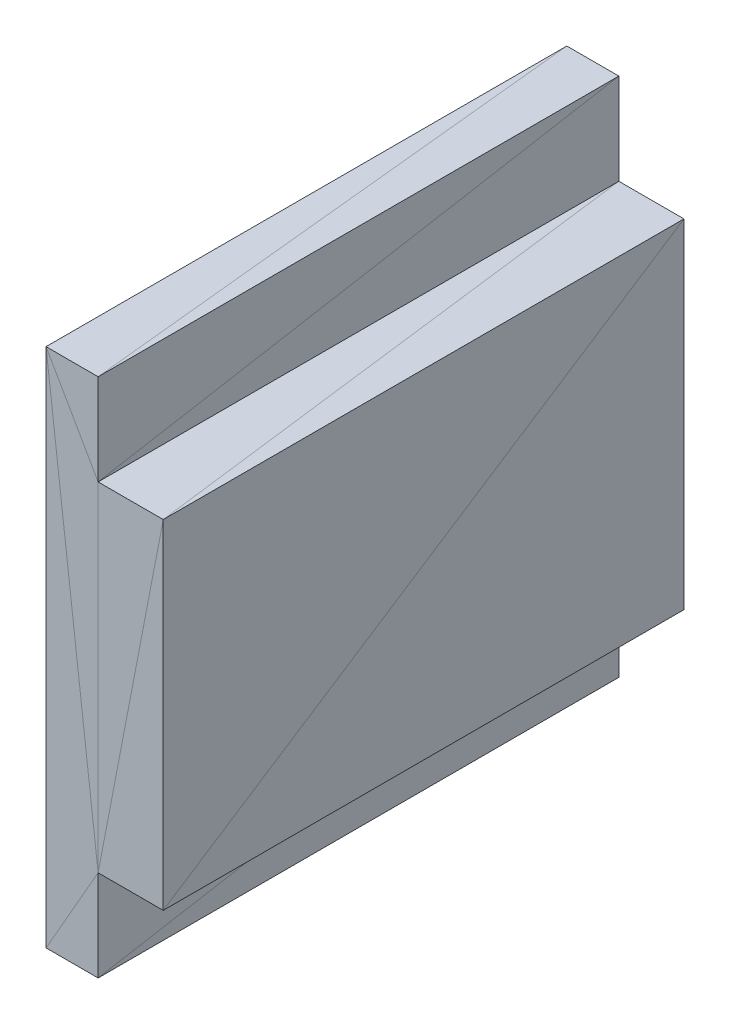
ISO-10303-21;
HEADER;
FILE_DESCRIPTION(('STEP AP214'),'2;1');
FILE_NAME('part.step','',(''),(''),'','','');
FILE_SCHEMA(('AUTOMOTIVE_DESIGN { 1 0 10303 214 1 1 1 1 }'));
ENDSEC;
DATA;
#1=APPLICATION_CONTEXT('core data for automotive mechanical design processes');
#2=APPLICATION_PROTOCOL_DEFINITION('international standard','automotive_design',2000,#1);
#3=PRODUCT_CONTEXT('',#1,'mechanical');
#4=PRODUCT('Part','Part','',(#3));
#5=PRODUCT_RELATED_PRODUCT_CATEGORY('part','',(#4));
#6=PRODUCT_DEFINITION_FORMATION('','',#4);
#7=PRODUCT_DEFINITION_CONTEXT('part definition',#1,'design');
#8=PRODUCT_DEFINITION('design','',#6,#7);
#9=PRODUCT_DEFINITION_SHAPE('','',#8);
#10=(LENGTH_UNIT() NAMED_UNIT(*) SI_UNIT(.MILLI.,.METRE.));
#11=(NAMED_UNIT(*) PLANE_ANGLE_UNIT() SI_UNIT($,.RADIAN.));
#12=(NAMED_UNIT(*) SI_UNIT($,.STERADIAN.) SOLID_ANGLE_UNIT());
#13=UNCERTAINTY_MEASURE_WITH_UNIT(LENGTH_MEASURE(1.E-05),#10,'distance_accuracy_value','');
#14=(GEOMETRIC_REPRESENTATION_CONTEXT(3) GLOBAL_UNCERTAINTY_ASSIGNED_CONTEXT((#13)) GLOBAL_UNIT_ASSIGNED_CONTEXT((#10,
#11,#12)) REPRESENTATION_CONTEXT('',''));
#15=CARTESIAN_POINT('',(0.,0.,0.));
#16=DIRECTION('',(0.,0.,1.));
#17=DIRECTION('',(1.,0.,0.));
#18=AXIS2_PLACEMENT_3D('',#15,#16,#17);
#19=CARTESIAN_POINT('',(0.,0.,0.));
#20=DIRECTION('',(0.,0.,1.));
#21=DIRECTION('',(1.,0.,0.));
#22=AXIS2_PLACEMENT_3D('',#19,#20,#21);
#23=PLANE('',#22);
#24=DIRECTION('',(0.,1.,0.));
#25=VECTOR('',#24,1.);
#26=CARTESIAN_POINT('',(5.71499997749925,4.44499962031841,0.));
#27=LINE('',#26,#25);
#28=CARTESIAN_POINT('',(5.71499997749925,4.44499962031841,0.));
#29=VERTEX_POINT('',#28);
#30=CARTESIAN_POINT('',(5.71499997749925,20.9550000727177,0.));
#31=VERTEX_POINT('',#30);
#32=EDGE_CURVE('E19',#29,#31,#27,.T.);
#33=ORIENTED_EDGE('',*,*,#32,.F.);
#34=DIRECTION('',(0.1888473864591,-0.982006448363537,0.));
#35=VECTOR('',#34,1.);
#36=CARTESIAN_POINT('',(2.54000001586974,20.9550000727177,0.));
#37=LINE('',#36,#35);
#38=CARTESIAN_POINT('',(2.54000001586974,20.9550000727177,0.));
#39=VERTEX_POINT('',#38);
#40=EDGE_CURVE('E98',#39,#29,#37,.T.);
#41=ORIENTED_EDGE('',*,*,#40,.F.);
#42=DIRECTION('',(-1.,0.,0.));
#43=VECTOR('',#42,1.);
#44=CARTESIAN_POINT('',(5.71499997749925,20.9550000727177,0.));
#45=LINE('',#44,#43);
#46=EDGE_CURVE('E101',#31,#39,#45,.T.);
#47=ORIENTED_EDGE('',*,*,#46,.F.);
#48=EDGE_LOOP('',(#33,#41,#47));
#49=FACE_BOUND('',#48,.T.);
#50=ADVANCED_FACE('F16',(#49),#23,.F.);
#51=CARTESIAN_POINT('',(5.71499997749925,0.,0.));
#52=DIRECTION('',(-1.,0.,0.));
#53=DIRECTION('',(0.,0.,1.));
#54=AXIS2_PLACEMENT_3D('',#51,#52,#53);
#55=PLANE('',#54);
#56=ORIENTED_EDGE('',*,*,#32,.T.);
#57=DIRECTION('',(0.,0.544988365723572,-0.838443606467335));
#58=VECTOR('',#57,1.);
#59=CARTESIAN_POINT('',(5.71499997749925,4.44499962031841,25.3999996930361));
#60=LINE('',#59,#58);
#61=CARTESIAN_POINT('',(5.71499997749925,4.44499962031841,25.3999996930361));
#62=VERTEX_POINT('',#61);
#63=EDGE_CURVE('E88',#62,#31,#60,.T.);
#64=ORIENTED_EDGE('',*,*,#63,.F.);
#65=DIRECTION('',(0.,0.,1.));
#66=VECTOR('',#65,1.);
#67=CARTESIAN_POINT('',(5.71499997749925,4.44499962031841,0.));
#68=LINE('',#67,#66);
#69=EDGE_CURVE('E84',#29,#62,#68,.T.);
#70=ORIENTED_EDGE('',*,*,#69,.F.);
#71=EDGE_LOOP('',(#56,#64,#70));
#72=FACE_BOUND('',#71,.T.);
#73=ADVANCED_FACE('F86',(#72),#55,.F.);
#74=CARTESIAN_POINT('',(5.71499997749925,0.,0.));
#75=DIRECTION('',(1.,0.,0.));
#76=DIRECTION('',(0.,0.,-1.));
#77=AXIS2_PLACEMENT_3D('',#74,#75,#76);
#78=PLANE('',#77);
#79=DIRECTION('',(0.,0.,-1.));
#80=VECTOR('',#79,1.);
#81=CARTESIAN_POINT('',(5.71499997749925,20.9550000727177,25.3999996930361));
#82=LINE('',#81,#80);
#83=CARTESIAN_POINT('',(5.71499997749925,20.9550000727177,25.3999996930361));
#84=VERTEX_POINT('',#83);
#85=EDGE_CURVE('E122',#84,#31,#82,.T.);
#86=ORIENTED_EDGE('',*,*,#85,.F.);
#87=DIRECTION('',(0.,1.,0.));
#88=VECTOR('',#87,1.);
#89=CARTESIAN_POINT('',(5.71499997749925,4.44499962031841,25.3999996930361));
#90=LINE('',#89,#88);
#91=EDGE_CURVE('E78',#62,#84,#90,.T.);
#92=ORIENTED_EDGE('',*,*,#91,.F.);
#93=ORIENTED_EDGE('',*,*,#63,.T.);
#94=EDGE_LOOP('',(#86,#92,#93));
#95=FACE_BOUND('',#94,.T.);
#96=ADVANCED_FACE('F126',(#95),#78,.T.);
#97=CARTESIAN_POINT('',(0.,0.,0.));
#98=DIRECTION('',(0.,0.,-1.));
#99=DIRECTION('',(-1.,0.,0.));
#100=AXIS2_PLACEMENT_3D('',#97,#98,#99);
#101=PLANE('',#100);
#102=DIRECTION('',(1.,0.,0.));
#103=VECTOR('',#102,1.);
#104=CARTESIAN_POINT('',(2.54000001586974,4.44499962031841,0.));
#105=LINE('',#104,#103);
#106=CARTESIAN_POINT('',(2.54000001586974,4.44499962031841,0.));
#107=VERTEX_POINT('',#106);
#108=EDGE_CURVE('E94',#107,#29,#105,.T.);
#109=ORIENTED_EDGE('',*,*,#108,.F.);
#110=DIRECTION('',(0.,-1.,0.));
#111=VECTOR('',#110,1.);
#112=CARTESIAN_POINT('',(2.54000001586974,20.9550000727177,0.));
#113=LINE('',#112,#111);
#114=EDGE_CURVE('E108',#39,#107,#113,.T.);
#115=ORIENTED_EDGE('',*,*,#114,.F.);
#116=ORIENTED_EDGE('',*,*,#40,.T.);
#117=EDGE_LOOP('',(#109,#115,#116));
#118=FACE_BOUND('',#117,.T.);
#119=ADVANCED_FACE('F106',(#118),#101,.T.);
#120=CARTESIAN_POINT('',(0.,0.,25.3999996930361));
#121=DIRECTION('',(0.,0.,-1.));
#122=DIRECTION('',(-1.,0.,0.));
#123=AXIS2_PLACEMENT_3D('',#120,#121,#122);
#124=PLANE('',#123);
#125=ORIENTED_EDGE('',*,*,#91,.T.);
#126=DIRECTION('',(0.1888473864591,0.982006448363537,0.));
#127=VECTOR('',#126,1.);
#128=CARTESIAN_POINT('',(2.54000001586974,4.44499962031841,25.3999996930361));
#129=LINE('',#128,#127);
#130=CARTESIAN_POINT('',(2.54000001586974,4.44499962031841,25.3999996930361));
#131=VERTEX_POINT('',#130);
#132=EDGE_CURVE('E119',#131,#84,#129,.T.);
#133=ORIENTED_EDGE('',*,*,#132,.F.);
#134=DIRECTION('',(-1.,0.,0.));
#135=VECTOR('',#134,1.);
#136=CARTESIAN_POINT('',(5.71499997749925,4.44499962031841,25.3999996930361));
#137=LINE('',#136,#135);
#138=EDGE_CURVE('E93',#62,#131,#137,.T.);
#139=ORIENTED_EDGE('',*,*,#138,.F.);
#140=EDGE_LOOP('',(#125,#133,#139));
#141=FACE_BOUND('',#140,.T.);
#142=ADVANCED_FACE('F442',(#141),#124,.F.);
#143=CARTESIAN_POINT('',(0.,4.44499962031841,0.));
#144=DIRECTION('',(0.,1.,0.));
#145=DIRECTION('',(0.,0.,1.));
#146=AXIS2_PLACEMENT_3D('',#143,#144,#145);
#147=PLANE('',#146);
#148=ORIENTED_EDGE('',*,*,#108,.T.);
#149=DIRECTION('',(0.124034734589208,0.,-0.992277876713668));
#150=VECTOR('',#149,1.);
#151=CARTESIAN_POINT('',(2.54000001586974,4.44499962031841,25.3999996930361));
#152=LINE('',#151,#150);
#153=EDGE_CURVE('E114',#131,#29,#152,.T.);
#154=ORIENTED_EDGE('',*,*,#153,.F.);
#155=DIRECTION('',(0.,0.,1.));
#156=VECTOR('',#155,1.);
#157=CARTESIAN_POINT('',(2.54000001586974,4.44499962031841,0.));
#158=LINE('',#157,#156);
#159=EDGE_CURVE('E116',#107,#131,#158,.T.);
#160=ORIENTED_EDGE('',*,*,#159,.F.);
#161=EDGE_LOOP('',(#148,#154,#160));
#162=FACE_BOUND('',#161,.T.);
#163=ADVANCED_FACE('F113',(#162),#147,.F.);
#164=CARTESIAN_POINT('',(0.,4.44499962031841,0.));
#165=DIRECTION('',(0.,-1.,0.));
#166=DIRECTION('',(0.,0.,-1.));
#167=AXIS2_PLACEMENT_3D('',#164,#165,#166);
#168=PLANE('',#167);
#169=ORIENTED_EDGE('',*,*,#69,.T.);
#170=ORIENTED_EDGE('',*,*,#138,.T.);
#171=ORIENTED_EDGE('',*,*,#153,.T.);
#172=EDGE_LOOP('',(#169,#170,#171));
#173=FACE_BOUND('',#172,.T.);
#174=ADVANCED_FACE('F118',(#173),#168,.T.);
#175=CARTESIAN_POINT('',(0.,0.,25.3999996930361));
#176=DIRECTION('',(0.,0.,1.));
#177=DIRECTION('',(1.,0.,0.));
#178=AXIS2_PLACEMENT_3D('',#175,#176,#177);
#179=PLANE('',#178);
#180=DIRECTION('',(1.,0.,0.));
#181=VECTOR('',#180,1.);
#182=CARTESIAN_POINT('',(2.54000001586974,20.9550000727177,25.3999996930361));
#183=LINE('',#182,#181);
#184=CARTESIAN_POINT('',(2.54000001586974,20.9550000727177,25.3999996930361));
#185=VERTEX_POINT('',#184);
#186=EDGE_CURVE('E135',#185,#84,#183,.T.);
#187=ORIENTED_EDGE('',*,*,#186,.F.);
#188=DIRECTION('',(0.,1.,0.));
#189=VECTOR('',#188,1.);
#190=CARTESIAN_POINT('',(2.54000001586974,4.44499962031841,25.3999996930361));
#191=LINE('',#190,#189);
#192=EDGE_CURVE('E137',#131,#185,#191,.T.);
#193=ORIENTED_EDGE('',*,*,#192,.F.);
#194=ORIENTED_EDGE('',*,*,#132,.T.);
#195=EDGE_LOOP('',(#187,#193,#194));
#196=FACE_BOUND('',#195,.T.);
#197=ADVANCED_FACE('F133',(#196),#179,.T.);
#198=CARTESIAN_POINT('',(0.,20.9550000727177,0.));
#199=DIRECTION('',(0.,-1.,0.));
#200=DIRECTION('',(0.,0.,-1.));
#201=AXIS2_PLACEMENT_3D('',#198,#199,#200);
#202=PLANE('',#201);
#203=ORIENTED_EDGE('',*,*,#46,.T.);
#204=DIRECTION('',(-0.124034734589208,0.,-0.992277876713668));
#205=VECTOR('',#204,1.);
#206=CARTESIAN_POINT('',(5.71499997749925,20.9550000727177,25.3999996930361));
#207=LINE('',#206,#205);
#208=EDGE_CURVE('E140',#84,#39,#207,.T.);
#209=ORIENTED_EDGE('',*,*,#208,.F.);
#210=ORIENTED_EDGE('',*,*,#85,.T.);
#211=EDGE_LOOP('',(#203,#209,#210));
#212=FACE_BOUND('',#211,.T.);
#213=ADVANCED_FACE('F141',(#212),#202,.F.);
#214=CARTESIAN_POINT('',(0.,20.9550000727177,0.));
#215=DIRECTION('',(0.,1.,0.));
#216=DIRECTION('',(0.,0.,1.));
#217=AXIS2_PLACEMENT_3D('',#214,#215,#216);
#218=PLANE('',#217);
#219=DIRECTION('',(0.,0.,-1.));
#220=VECTOR('',#219,1.);
#221=CARTESIAN_POINT('',(2.54000001586974,20.9550000727177,25.3999996930361));
#222=LINE('',#221,#220);
#223=EDGE_CURVE('E146',#185,#39,#222,.T.);
#224=ORIENTED_EDGE('',*,*,#223,.F.);
#225=ORIENTED_EDGE('',*,*,#186,.T.);
#226=ORIENTED_EDGE('',*,*,#208,.T.);
#227=EDGE_LOOP('',(#224,#225,#226));
#228=FACE_BOUND('',#227,.T.);
#229=ADVANCED_FACE('F145',(#228),#218,.T.);
#230=CARTESIAN_POINT('',(0.,0.,0.));
#231=DIRECTION('',(0.,0.,1.));
#232=DIRECTION('',(1.,0.,0.));
#233=AXIS2_PLACEMENT_3D('',#230,#231,#232);
#234=PLANE('',#233);
#235=DIRECTION('',(0.,1.,0.));
#236=VECTOR('',#235,1.);
#237=CARTESIAN_POINT('',(2.54000001586974,20.9550000727177,0.));
#238=LINE('',#237,#236);
#239=CARTESIAN_POINT('',(2.54000001586974,25.3999996930361,0.));
#240=VERTEX_POINT('',#239);
#241=EDGE_CURVE('E154',#39,#240,#238,.T.);
#242=ORIENTED_EDGE('',*,*,#241,.F.);
#243=DIRECTION('',(0.496138972640912,-0.868243122533556,0.));
#244=VECTOR('',#243,1.);
#245=CARTESIAN_POINT('',(0.,25.3999996930361,0.));
#246=LINE('',#245,#244);
#247=CARTESIAN_POINT('',(0.,25.3999996930361,0.));
#248=VERTEX_POINT('',#247);
#249=EDGE_CURVE('E196',#248,#39,#246,.T.);
#250=ORIENTED_EDGE('',*,*,#249,.F.);
#251=DIRECTION('',(-1.,0.,0.));
#252=VECTOR('',#251,1.);
#253=CARTESIAN_POINT('',(2.54000001586974,25.3999996930361,0.));
#254=LINE('',#253,#252);
#255=EDGE_CURVE('E143',#240,#248,#254,.T.);
#256=ORIENTED_EDGE('',*,*,#255,.F.);
#257=EDGE_LOOP('',(#242,#250,#256));
#258=FACE_BOUND('',#257,.T.);
#259=ADVANCED_FACE('F398',(#258),#234,.F.);
#260=CARTESIAN_POINT('',(0.,25.3999996930361,0.));
#261=DIRECTION('',(0.,-1.,0.));
#262=DIRECTION('',(0.,0.,-1.));
#263=AXIS2_PLACEMENT_3D('',#260,#261,#262);
#264=PLANE('',#263);
#265=ORIENTED_EDGE('',*,*,#255,.T.);
#266=DIRECTION('',(-0.0995037208271512,0.,-0.995037190029374));
#267=VECTOR('',#266,1.);
#268=CARTESIAN_POINT('',(2.54000001586974,25.3999996930361,25.3999996930361));
#269=LINE('',#268,#267);
#270=CARTESIAN_POINT('',(2.54000001586974,25.3999996930361,25.3999996930361));
#271=VERTEX_POINT('',#270);
#272=EDGE_CURVE('E192',#271,#248,#269,.T.);
#273=ORIENTED_EDGE('',*,*,#272,.F.);
#274=DIRECTION('',(0.,0.,1.));
#275=VECTOR('',#274,1.);
#276=CARTESIAN_POINT('',(2.54000001586974,25.3999996930361,0.));
#277=LINE('',#276,#275);
#278=EDGE_CURVE('E157',#240,#271,#277,.T.);
#279=ORIENTED_EDGE('',*,*,#278,.F.);
#280=EDGE_LOOP('',(#265,#273,#279));
#281=FACE_BOUND('',#280,.T.);
#282=ADVANCED_FACE('F249',(#281),#264,.F.);
#283=CARTESIAN_POINT('',(0.,0.,25.3999996930361));
#284=DIRECTION('',(0.,0.,1.));
#285=DIRECTION('',(1.,0.,0.));
#286=AXIS2_PLACEMENT_3D('',#283,#284,#285);
#287=PLANE('',#286);
#288=DIRECTION('',(0.,-1.,0.));
#289=VECTOR('',#288,1.);
#290=CARTESIAN_POINT('',(2.54000001586974,25.3999996930361,25.3999996930361));
#291=LINE('',#290,#289);
#292=EDGE_CURVE('E160',#271,#185,#291,.T.);
#293=ORIENTED_EDGE('',*,*,#292,.F.);
#294=DIRECTION('',(1.,0.,0.));
#295=VECTOR('',#294,1.);
#296=CARTESIAN_POINT('',(0.,25.3999996930361,25.3999996930361));
#297=LINE('',#296,#295);
#298=CARTESIAN_POINT('',(0.,25.3999996930361,25.3999996930361));
#299=VERTEX_POINT('',#298);
#300=EDGE_CURVE('E193',#299,#271,#297,.T.);
#301=ORIENTED_EDGE('',*,*,#300,.F.);
#302=DIRECTION('',(-0.496138972640912,0.868243122533556,0.));
#303=VECTOR('',#302,1.);
#304=CARTESIAN_POINT('',(2.54000001586974,20.9550000727177,25.3999996930361));
#305=LINE('',#304,#303);
#306=EDGE_CURVE('E186',#185,#299,#305,.T.);
#307=ORIENTED_EDGE('',*,*,#306,.F.);
#308=EDGE_LOOP('',(#293,#301,#307));
#309=FACE_BOUND('',#308,.T.);
#310=ADVANCED_FACE('F255',(#309),#287,.T.);
#311=CARTESIAN_POINT('',(2.54000001586974,0.,0.));
#312=DIRECTION('',(-1.,0.,0.));
#313=DIRECTION('',(0.,0.,1.));
#314=AXIS2_PLACEMENT_3D('',#311,#312,#313);
#315=PLANE('',#314);
#316=ORIENTED_EDGE('',*,*,#241,.T.);
#317=DIRECTION('',(0.,0.172380319486799,-0.985030469302158));
#318=VECTOR('',#317,1.);
#319=CARTESIAN_POINT('',(2.54000001586974,20.9550000727177,25.3999996930361));
#320=LINE('',#319,#318);
#321=EDGE_CURVE('E161',#185,#240,#320,.T.);
#322=ORIENTED_EDGE('',*,*,#321,.F.);
#323=ORIENTED_EDGE('',*,*,#223,.T.);
#324=EDGE_LOOP('',(#316,#322,#323));
#325=FACE_BOUND('',#324,.T.);
#326=ADVANCED_FACE('F375',(#325),#315,.F.);
#327=CARTESIAN_POINT('',(2.54000001586974,0.,0.));
#328=DIRECTION('',(1.,0.,0.));
#329=DIRECTION('',(0.,0.,-1.));
#330=AXIS2_PLACEMENT_3D('',#327,#328,#329);
#331=PLANE('',#330);
#332=ORIENTED_EDGE('',*,*,#278,.T.);
#333=ORIENTED_EDGE('',*,*,#292,.T.);
#334=ORIENTED_EDGE('',*,*,#321,.T.);
#335=EDGE_LOOP('',(#332,#333,#334));
#336=FACE_BOUND('',#335,.T.);
#337=ADVANCED_FACE('F252',(#336),#331,.T.);
#338=CARTESIAN_POINT('',(0.,0.,0.));
#339=DIRECTION('',(0.,0.,-1.));
#340=DIRECTION('',(-1.,0.,0.));
#341=AXIS2_PLACEMENT_3D('',#338,#339,#340);
#342=PLANE('',#341);
#343=ORIENTED_EDGE('',*,*,#114,.T.);
#344=DIRECTION('',(0.496138972640912,0.868243122533556,0.));
#345=VECTOR('',#344,1.);
#346=CARTESIAN_POINT('',(0.,0.,0.));
#347=LINE('',#346,#345);
#348=CARTESIAN_POINT('',(0.,0.,0.));
#349=VERTEX_POINT('',#348);
#350=EDGE_CURVE('E167',#349,#107,#347,.T.);
#351=ORIENTED_EDGE('',*,*,#350,.F.);
#352=DIRECTION('',(-0.120331367848647,-0.99273378199378,0.));
#353=VECTOR('',#352,1.);
#354=CARTESIAN_POINT('',(2.54000001586974,20.9550000727177,0.));
#355=LINE('',#354,#353);
#356=EDGE_CURVE('E201',#39,#349,#355,.T.);
#357=ORIENTED_EDGE('',*,*,#356,.F.);
#358=EDGE_LOOP('',(#343,#351,#357));
#359=FACE_BOUND('',#358,.T.);
#360=ADVANCED_FACE('F360',(#359),#342,.T.);
#361=CARTESIAN_POINT('',(0.,0.,0.));
#362=DIRECTION('',(0.,0.,-1.));
#363=DIRECTION('',(-1.,0.,0.));
#364=AXIS2_PLACEMENT_3D('',#361,#362,#363);
#365=PLANE('',#364);
#366=DIRECTION('',(0.,1.,0.));
#367=VECTOR('',#366,1.);
#368=CARTESIAN_POINT('',(2.54000001586974,0.,0.));
#369=LINE('',#368,#367);
#370=CARTESIAN_POINT('',(2.54000001586974,0.,0.));
#371=VERTEX_POINT('',#370);
#372=EDGE_CURVE('E169',#371,#107,#369,.T.);
#373=ORIENTED_EDGE('',*,*,#372,.F.);
#374=DIRECTION('',(1.,0.,0.));
#375=VECTOR('',#374,1.);
#376=CARTESIAN_POINT('',(0.,0.,0.));
#377=LINE('',#376,#375);
#378=EDGE_CURVE('E34',#349,#371,#377,.T.);
#379=ORIENTED_EDGE('',*,*,#378,.F.);
#380=ORIENTED_EDGE('',*,*,#350,.T.);
#381=EDGE_LOOP('',(#373,#379,#380));
#382=FACE_BOUND('',#381,.T.);
#383=ADVANCED_FACE('F351',(#382),#365,.T.);
#384=CARTESIAN_POINT('',(2.54000001586974,0.,0.));
#385=DIRECTION('',(-1.,0.,0.));
#386=DIRECTION('',(0.,0.,1.));
#387=AXIS2_PLACEMENT_3D('',#384,#385,#386);
#388=PLANE('',#387);
#389=ORIENTED_EDGE('',*,*,#372,.T.);
#390=DIRECTION('',(0.,0.172380319486799,-0.985030469302158));
#391=VECTOR('',#390,1.);
#392=CARTESIAN_POINT('',(2.54000001586974,0.,25.3999996930361));
#393=LINE('',#392,#391);
#394=CARTESIAN_POINT('',(2.54000001586974,0.,25.3999996930361));
#395=VERTEX_POINT('',#394);
#396=EDGE_CURVE('E173',#395,#107,#393,.T.);
#397=ORIENTED_EDGE('',*,*,#396,.F.);
#398=DIRECTION('',(0.,0.,1.));
#399=VECTOR('',#398,1.);
#400=CARTESIAN_POINT('',(2.54000001586974,0.,0.));
#401=LINE('',#400,#399);
#402=EDGE_CURVE('E179',#371,#395,#401,.T.);
#403=ORIENTED_EDGE('',*,*,#402,.F.);
#404=EDGE_LOOP('',(#389,#397,#403));
#405=FACE_BOUND('',#404,.T.);
#406=ADVANCED_FACE('F342',(#405),#388,.F.);
#407=CARTESIAN_POINT('',(2.54000001586974,0.,0.));
#408=DIRECTION('',(1.,0.,0.));
#409=DIRECTION('',(0.,0.,-1.));
#410=AXIS2_PLACEMENT_3D('',#407,#408,#409);
#411=PLANE('',#410);
#412=ORIENTED_EDGE('',*,*,#159,.T.);
#413=DIRECTION('',(0.,1.,0.));
#414=VECTOR('',#413,1.);
#415=CARTESIAN_POINT('',(2.54000001586974,0.,25.3999996930361));
#416=LINE('',#415,#414);
#417=EDGE_CURVE('E176',#395,#131,#416,.T.);
#418=ORIENTED_EDGE('',*,*,#417,.F.);
#419=ORIENTED_EDGE('',*,*,#396,.T.);
#420=EDGE_LOOP('',(#412,#418,#419));
#421=FACE_BOUND('',#420,.T.);
#422=ADVANCED_FACE('F334',(#421),#411,.T.);
#423=CARTESIAN_POINT('',(0.,0.,25.3999996930361));
#424=DIRECTION('',(0.,0.,-1.));
#425=DIRECTION('',(-1.,0.,0.));
#426=AXIS2_PLACEMENT_3D('',#423,#424,#425);
#427=PLANE('',#426);
#428=ORIENTED_EDGE('',*,*,#417,.T.);
#429=DIRECTION('',(0.496138972640912,0.868243122533556,0.));
#430=VECTOR('',#429,1.);
#431=CARTESIAN_POINT('',(0.,0.,25.3999996930361));
#432=LINE('',#431,#430);
#433=CARTESIAN_POINT('',(0.,0.,25.3999996930361));
#434=VERTEX_POINT('',#433);
#435=EDGE_CURVE('E204',#434,#131,#432,.T.);
#436=ORIENTED_EDGE('',*,*,#435,.F.);
#437=DIRECTION('',(-1.,0.,0.));
#438=VECTOR('',#437,1.);
#439=CARTESIAN_POINT('',(2.54000001586974,0.,25.3999996930361));
#440=LINE('',#439,#438);
#441=EDGE_CURVE('E182',#395,#434,#440,.T.);
#442=ORIENTED_EDGE('',*,*,#441,.F.);
#443=EDGE_LOOP('',(#428,#436,#442));
#444=FACE_BOUND('',#443,.T.);
#445=ADVANCED_FACE('F231',(#444),#427,.F.);
#446=CARTESIAN_POINT('',(0.,0.,0.));
#447=DIRECTION('',(0.,1.,0.));
#448=DIRECTION('',(0.,0.,1.));
#449=AXIS2_PLACEMENT_3D('',#446,#447,#448);
#450=PLANE('',#449);
#451=ORIENTED_EDGE('',*,*,#378,.T.);
#452=DIRECTION('',(0.0995037208271512,0.,-0.995037190029374));
#453=VECTOR('',#452,1.);
#454=CARTESIAN_POINT('',(0.,0.,25.3999996930361));
#455=LINE('',#454,#453);
#456=EDGE_CURVE('E183',#434,#371,#455,.T.);
#457=ORIENTED_EDGE('',*,*,#456,.F.);
#458=DIRECTION('',(0.,0.,1.));
#459=VECTOR('',#458,1.);
#460=CARTESIAN_POINT('',(0.,0.,0.));
#461=LINE('',#460,#459);
#462=EDGE_CURVE('E216',#349,#434,#461,.T.);
#463=ORIENTED_EDGE('',*,*,#462,.F.);
#464=EDGE_LOOP('',(#451,#457,#463));
#465=FACE_BOUND('',#464,.T.);
#466=ADVANCED_FACE('F236',(#465),#450,.F.);
#467=CARTESIAN_POINT('',(0.,0.,0.));
#468=DIRECTION('',(0.,-1.,0.));
#469=DIRECTION('',(0.,0.,-1.));
#470=AXIS2_PLACEMENT_3D('',#467,#468,#469);
#471=PLANE('',#470);
#472=ORIENTED_EDGE('',*,*,#402,.T.);
#473=ORIENTED_EDGE('',*,*,#441,.T.);
#474=ORIENTED_EDGE('',*,*,#456,.T.);
#475=EDGE_LOOP('',(#472,#473,#474));
#476=FACE_BOUND('',#475,.T.);
#477=ADVANCED_FACE('F234',(#476),#471,.T.);
#478=CARTESIAN_POINT('',(0.,0.,25.3999996930361));
#479=DIRECTION('',(0.,0.,1.));
#480=DIRECTION('',(1.,0.,0.));
#481=AXIS2_PLACEMENT_3D('',#478,#479,#480);
#482=PLANE('',#481);
#483=ORIENTED_EDGE('',*,*,#192,.T.);
#484=ORIENTED_EDGE('',*,*,#306,.T.);
#485=DIRECTION('',(-0.120331367848647,0.99273378199378,0.));
#486=VECTOR('',#485,1.);
#487=CARTESIAN_POINT('',(2.54000001586974,4.44499962031841,25.3999996930361));
#488=LINE('',#487,#486);
#489=EDGE_CURVE('E207',#131,#299,#488,.T.);
#490=ORIENTED_EDGE('',*,*,#489,.F.);
#491=EDGE_LOOP('',(#483,#484,#490));
#492=FACE_BOUND('',#491,.T.);
#493=ADVANCED_FACE('F257',(#492),#482,.T.);
#494=CARTESIAN_POINT('',(0.,25.3999996930361,0.));
#495=DIRECTION('',(0.,1.,0.));
#496=DIRECTION('',(0.,0.,1.));
#497=AXIS2_PLACEMENT_3D('',#494,#495,#496);
#498=PLANE('',#497);
#499=DIRECTION('',(0.,0.,-1.));
#500=VECTOR('',#499,1.);
#501=CARTESIAN_POINT('',(0.,25.3999996930361,25.3999996930361));
#502=LINE('',#501,#500);
#503=EDGE_CURVE('E210',#299,#248,#502,.T.);
#504=ORIENTED_EDGE('',*,*,#503,.F.);
#505=ORIENTED_EDGE('',*,*,#300,.T.);
#506=ORIENTED_EDGE('',*,*,#272,.T.);
#507=EDGE_LOOP('',(#504,#505,#506));
#508=FACE_BOUND('',#507,.T.);
#509=ADVANCED_FACE('F246',(#508),#498,.T.);
#510=CARTESIAN_POINT('',(0.,0.,0.));
#511=DIRECTION('',(0.,0.,1.));
#512=DIRECTION('',(1.,0.,0.));
#513=AXIS2_PLACEMENT_3D('',#510,#511,#512);
#514=PLANE('',#513);
#515=ORIENTED_EDGE('',*,*,#356,.T.);
#516=DIRECTION('',(0.,-1.,0.));
#517=VECTOR('',#516,1.);
#518=CARTESIAN_POINT('',(0.,25.3999996930361,0.));
#519=LINE('',#518,#517);
#520=EDGE_CURVE('E213',#248,#349,#519,.T.);
#521=ORIENTED_EDGE('',*,*,#520,.F.);
#522=ORIENTED_EDGE('',*,*,#249,.T.);
#523=EDGE_LOOP('',(#515,#521,#522));
#524=FACE_BOUND('',#523,.T.);
#525=ADVANCED_FACE('F240',(#524),#514,.F.);
#526=CARTESIAN_POINT('',(0.,0.,25.3999996930361));
#527=DIRECTION('',(0.,0.,-1.));
#528=DIRECTION('',(-1.,0.,0.));
#529=AXIS2_PLACEMENT_3D('',#526,#527,#528);
#530=PLANE('',#529);
#531=ORIENTED_EDGE('',*,*,#489,.T.);
#532=DIRECTION('',(0.,1.,0.));
#533=VECTOR('',#532,1.);
#534=CARTESIAN_POINT('',(0.,0.,25.3999996930361));
#535=LINE('',#534,#533);
#536=EDGE_CURVE('E25',#434,#299,#535,.T.);
#537=ORIENTED_EDGE('',*,*,#536,.F.);
#538=ORIENTED_EDGE('',*,*,#435,.T.);
#539=EDGE_LOOP('',(#531,#537,#538));
#540=FACE_BOUND('',#539,.T.);
#541=ADVANCED_FACE('F226',(#540),#530,.F.);
#542=CARTESIAN_POINT('',(0.,0.,0.));
#543=DIRECTION('',(1.,0.,0.));
#544=DIRECTION('',(0.,0.,-1.));
#545=AXIS2_PLACEMENT_3D('',#542,#543,#544);
#546=PLANE('',#545);
#547=ORIENTED_EDGE('',*,*,#520,.T.);
#548=DIRECTION('',(0.,-0.707106781186548,-0.707106781186548));
#549=VECTOR('',#548,1.);
#550=CARTESIAN_POINT('',(0.,25.3999996930361,25.3999996930361));
#551=LINE('',#550,#549);
#552=EDGE_CURVE('E10',#299,#349,#551,.T.);
#553=ORIENTED_EDGE('',*,*,#552,.F.);
#554=ORIENTED_EDGE('',*,*,#503,.T.);
#555=EDGE_LOOP('',(#547,#553,#554));
#556=FACE_BOUND('',#555,.T.);
#557=ADVANCED_FACE('F243',(#556),#546,.F.);
#558=CARTESIAN_POINT('',(0.,0.,0.));
#559=DIRECTION('',(-1.,0.,0.));
#560=DIRECTION('',(0.,0.,1.));
#561=AXIS2_PLACEMENT_3D('',#558,#559,#560);
#562=PLANE('',#561);
#563=ORIENTED_EDGE('',*,*,#462,.T.);
#564=ORIENTED_EDGE('',*,*,#536,.T.);
#565=ORIENTED_EDGE('',*,*,#552,.T.);
#566=EDGE_LOOP('',(#563,#564,#565));
#567=FACE_BOUND('',#566,.T.);
#568=ADVANCED_FACE('F222',(#567),#562,.T.);
#569=CLOSED_SHELL('',(#50,#73,#96,#119,#142,#163,#174,#197,#213,#229,#259,#282,#310,#326,#337,
#360,#383,#406,#422,#445,#466,#477,#493,#509,#525,#541,#557,#568));
#570=MANIFOLD_SOLID_BREP('B1',#569);
#571=ADVANCED_BREP_SHAPE_REPRESENTATION('',(#18,#570),#14);
#572=SHAPE_DEFINITION_REPRESENTATION(#9,#571);
ENDSEC;
END-ISO-10303-21;
